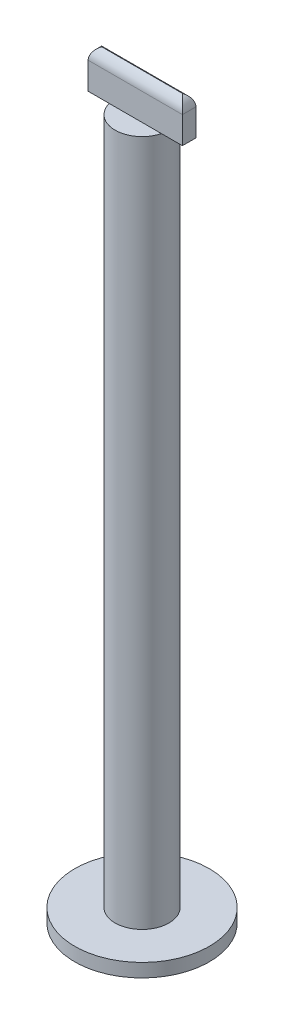
ISO-10303-21;
HEADER;
FILE_DESCRIPTION(('STEP AP214'),'2;1');
FILE_NAME('part.step','',(''),(''),'','','');
FILE_SCHEMA(('AUTOMOTIVE_DESIGN { 1 0 10303 214 1 1 1 1 }'));
ENDSEC;
DATA;
#1=APPLICATION_CONTEXT('core data for automotive mechanical design processes');
#2=APPLICATION_PROTOCOL_DEFINITION('international standard','automotive_design',2000,#1);
#3=PRODUCT_CONTEXT('',#1,'mechanical');
#4=PRODUCT('Part','Part','',(#3));
#5=PRODUCT_RELATED_PRODUCT_CATEGORY('part','',(#4));
#6=PRODUCT_DEFINITION_FORMATION('','',#4);
#7=PRODUCT_DEFINITION_CONTEXT('part definition',#1,'design');
#8=PRODUCT_DEFINITION('design','',#6,#7);
#9=PRODUCT_DEFINITION_SHAPE('','',#8);
#10=(LENGTH_UNIT() NAMED_UNIT(*) SI_UNIT(.MILLI.,.METRE.));
#11=(NAMED_UNIT(*) PLANE_ANGLE_UNIT() SI_UNIT($,.RADIAN.));
#12=(NAMED_UNIT(*) SI_UNIT($,.STERADIAN.) SOLID_ANGLE_UNIT());
#13=UNCERTAINTY_MEASURE_WITH_UNIT(LENGTH_MEASURE(1.E-05),#10,'distance_accuracy_value','');
#14=(GEOMETRIC_REPRESENTATION_CONTEXT(3) GLOBAL_UNCERTAINTY_ASSIGNED_CONTEXT((#13)) GLOBAL_UNIT_ASSIGNED_CONTEXT((#10,
#11,#12)) REPRESENTATION_CONTEXT('',''));
#15=CARTESIAN_POINT('',(0.,0.,0.));
#16=DIRECTION('',(0.,0.,1.));
#17=DIRECTION('',(1.,0.,0.));
#18=AXIS2_PLACEMENT_3D('',#15,#16,#17);
#19=CARTESIAN_POINT('',(2.5,54.,0.));
#20=DIRECTION('',(0.,0.,-1.));
#21=DIRECTION('',(-1.,0.,0.));
#22=AXIS2_PLACEMENT_3D('',#19,#20,#21);
#23=CYLINDRICAL_SURFACE('',#22,1.);
#24=CARTESIAN_POINT('',(2.5,54.,0.5));
#25=DIRECTION('',(-0.707106781186547,0.,-0.707106781186547));
#26=DIRECTION('',(0.707106781186547,0.,-0.707106781186547));
#27=AXIS2_PLACEMENT_3D('',#24,#25,#26);
#28=ELLIPSE('',#27,1.41421356237309,1.);
#29=CARTESIAN_POINT('',(3.5,54.,-0.5));
#30=VERTEX_POINT('',#29);
#31=CARTESIAN_POINT('',(3.,54.8660254037844,0.));
#32=VERTEX_POINT('',#31);
#33=EDGE_CURVE('E127',#30,#32,#28,.F.);
#34=ORIENTED_EDGE('',*,*,#33,.T.);
#35=CARTESIAN_POINT('',(2.5,54.,-0.5));
#36=DIRECTION('',(0.707106781186547,0.,-0.707106781186547));
#37=DIRECTION('',(-0.707106781186547,0.,-0.707106781186547));
#38=AXIS2_PLACEMENT_3D('',#35,#36,#37);
#39=ELLIPSE('',#38,1.41421356237309,1.);
#40=CARTESIAN_POINT('',(3.5,54.,0.5));
#41=VERTEX_POINT('',#40);
#42=EDGE_CURVE('E159',#41,#32,#39,.F.);
#43=ORIENTED_EDGE('',*,*,#42,.F.);
#44=DIRECTION('',(0.,0.,-1.));
#45=VECTOR('',#44,1.);
#46=CARTESIAN_POINT('',(3.5,54.,0.5));
#47=LINE('',#46,#45);
#48=EDGE_CURVE('E47',#30,#41,#47,.F.);
#49=ORIENTED_EDGE('',*,*,#48,.F.);
#50=EDGE_LOOP('',(#34,#43,#49));
#51=FACE_BOUND('',#50,.T.);
#52=ADVANCED_FACE('F39',(#51),#23,.T.);
#53=CARTESIAN_POINT('',(0.,54.,0.5));
#54=DIRECTION('',(-1.,0.,0.));
#55=DIRECTION('',(0.,0.,1.));
#56=AXIS2_PLACEMENT_3D('',#53,#54,#55);
#57=CYLINDRICAL_SURFACE('',#56,1.);
#58=DIRECTION('',(-1.,0.,0.));
#59=VECTOR('',#58,1.);
#60=CARTESIAN_POINT('',(0.,54.8660254037844,0.));
#61=LINE('',#60,#59);
#62=CARTESIAN_POINT('',(-3.,54.8660254037844,0.));
#63=VERTEX_POINT('',#62);
#64=EDGE_CURVE('E11',#32,#63,#61,.T.);
#65=ORIENTED_EDGE('',*,*,#64,.F.);
#66=ORIENTED_EDGE('',*,*,#33,.F.);
#67=DIRECTION('',(-1.,0.,0.));
#68=VECTOR('',#67,1.);
#69=CARTESIAN_POINT('',(-3.5,54.,-0.5));
#70=LINE('',#69,#68);
#71=CARTESIAN_POINT('',(-3.5,54.,-0.5));
#72=VERTEX_POINT('',#71);
#73=EDGE_CURVE('E101',#72,#30,#70,.F.);
#74=ORIENTED_EDGE('',*,*,#73,.F.);
#75=CARTESIAN_POINT('',(-2.5,54.,0.5));
#76=DIRECTION('',(-0.707106781186547,0.,0.707106781186547));
#77=DIRECTION('',(-0.707106781186547,0.,-0.707106781186547));
#78=AXIS2_PLACEMENT_3D('',#75,#76,#77);
#79=ELLIPSE('',#78,1.41421356237309,1.);
#80=EDGE_CURVE('E124',#63,#72,#79,.T.);
#81=ORIENTED_EDGE('',*,*,#80,.F.);
#82=EDGE_LOOP('',(#65,#66,#74,#81));
#83=FACE_BOUND('',#82,.T.);
#84=ADVANCED_FACE('F41',(#83),#57,.T.);
#85=CARTESIAN_POINT('',(-2.5,54.,0.));
#86=DIRECTION('',(0.,0.,1.));
#87=DIRECTION('',(1.,0.,0.));
#88=AXIS2_PLACEMENT_3D('',#85,#86,#87);
#89=CYLINDRICAL_SURFACE('',#88,1.);
#90=CARTESIAN_POINT('',(-2.5,54.,-0.5));
#91=DIRECTION('',(0.707106781186547,0.,0.707106781186547));
#92=DIRECTION('',(-0.707106781186547,0.,0.707106781186547));
#93=AXIS2_PLACEMENT_3D('',#90,#91,#92);
#94=ELLIPSE('',#93,1.41421356237309,1.);
#95=CARTESIAN_POINT('',(-3.5,54.,0.5));
#96=VERTEX_POINT('',#95);
#97=EDGE_CURVE('E161',#63,#96,#94,.T.);
#98=ORIENTED_EDGE('',*,*,#97,.F.);
#99=ORIENTED_EDGE('',*,*,#80,.T.);
#100=DIRECTION('',(0.,0.,1.));
#101=VECTOR('',#100,1.);
#102=CARTESIAN_POINT('',(-3.5,54.,0.5));
#103=LINE('',#102,#101);
#104=EDGE_CURVE('E154',#96,#72,#103,.F.);
#105=ORIENTED_EDGE('',*,*,#104,.F.);
#106=EDGE_LOOP('',(#98,#99,#105));
#107=FACE_BOUND('',#106,.T.);
#108=ADVANCED_FACE('F169',(#107),#89,.T.);
#109=CARTESIAN_POINT('',(0.,54.,-0.5));
#110=DIRECTION('',(1.,0.,0.));
#111=DIRECTION('',(0.,0.,-1.));
#112=AXIS2_PLACEMENT_3D('',#109,#110,#111);
#113=CYLINDRICAL_SURFACE('',#112,1.);
#114=ORIENTED_EDGE('',*,*,#42,.T.);
#115=ORIENTED_EDGE('',*,*,#64,.T.);
#116=ORIENTED_EDGE('',*,*,#97,.T.);
#117=DIRECTION('',(1.,0.,0.));
#118=VECTOR('',#117,1.);
#119=CARTESIAN_POINT('',(-3.5,54.,0.5));
#120=LINE('',#119,#118);
#121=EDGE_CURVE('E151',#41,#96,#120,.F.);
#122=ORIENTED_EDGE('',*,*,#121,.F.);
#123=EDGE_LOOP('',(#114,#115,#116,#122));
#124=FACE_BOUND('',#123,.T.);
#125=ADVANCED_FACE('F171',(#124),#113,.T.);
#126=CARTESIAN_POINT('',(0.,52.,0.));
#127=DIRECTION('',(0.,1.,0.));
#128=DIRECTION('',(0.,0.,1.));
#129=AXIS2_PLACEMENT_3D('',#126,#127,#128);
#130=PLANE('',#129);
#131=DIRECTION('',(1.,0.,0.));
#132=VECTOR('',#131,1.);
#133=CARTESIAN_POINT('',(-3.5,52.,0.5));
#134=LINE('',#133,#132);
#135=CARTESIAN_POINT('',(-1.93649167310371,52.,0.5));
#136=VERTEX_POINT('',#135);
#137=CARTESIAN_POINT('',(1.93649167310371,52.,0.5));
#138=VERTEX_POINT('',#137);
#139=EDGE_CURVE('E135',#136,#138,#134,.T.);
#140=ORIENTED_EDGE('',*,*,#139,.F.);
#141=CARTESIAN_POINT('',(0.,52.,0.));
#142=DIRECTION('',(0.,1.,0.));
#143=DIRECTION('',(0.,0.,1.));
#144=AXIS2_PLACEMENT_3D('',#141,#142,#143);
#145=CIRCLE('',#144,2.);
#146=EDGE_CURVE('E143',#136,#138,#145,.T.);
#147=ORIENTED_EDGE('',*,*,#146,.T.);
#148=EDGE_LOOP('',(#140,#147));
#149=FACE_BOUND('',#148,.T.);
#150=ADVANCED_FACE('F194',(#149),#130,.T.);
#151=CARTESIAN_POINT('',(0.,52.,0.));
#152=DIRECTION('',(0.,-1.,0.));
#153=DIRECTION('',(0.,0.,-1.));
#154=AXIS2_PLACEMENT_3D('',#151,#152,#153);
#155=CYLINDRICAL_SURFACE('',#154,2.);
#156=CARTESIAN_POINT('',(1.93649167310371,52.,-0.5));
#157=VERTEX_POINT('',#156);
#158=EDGE_CURVE('E115',#138,#157,#145,.T.);
#159=ORIENTED_EDGE('',*,*,#158,.F.);
#160=ORIENTED_EDGE('',*,*,#146,.F.);
#161=CARTESIAN_POINT('',(-1.93649167310371,52.,-0.5));
#162=VERTEX_POINT('',#161);
#163=EDGE_CURVE('E184',#162,#136,#145,.T.);
#164=ORIENTED_EDGE('',*,*,#163,.F.);
#165=EDGE_CURVE('E148',#157,#162,#145,.T.);
#166=ORIENTED_EDGE('',*,*,#165,.F.);
#167=EDGE_LOOP('',(#159,#160,#164,#166));
#168=FACE_BOUND('',#167,.T.);
#169=CARTESIAN_POINT('',(0.,1.,0.));
#170=DIRECTION('',(0.,-1.,0.));
#171=DIRECTION('',(0.,0.,-1.));
#172=AXIS2_PLACEMENT_3D('',#169,#170,#171);
#173=CIRCLE('',#172,2.);
#174=CARTESIAN_POINT('',(0.,1.,-2.));
#175=VERTEX_POINT('',#174);
#176=EDGE_CURVE('E147',#175,#175,#173,.T.);
#177=ORIENTED_EDGE('',*,*,#176,.F.);
#178=EDGE_LOOP('',(#177));
#179=FACE_BOUND('',#178,.T.);
#180=ADVANCED_FACE('F192',(#168,#179),#155,.T.);
#181=DIRECTION('',(-1.,0.,0.));
#182=VECTOR('',#181,1.);
#183=CARTESIAN_POINT('',(-3.5,52.,-0.5));
#184=LINE('',#183,#182);
#185=EDGE_CURVE('E119',#157,#162,#184,.T.);
#186=ORIENTED_EDGE('',*,*,#185,.F.);
#187=ORIENTED_EDGE('',*,*,#165,.T.);
#188=EDGE_LOOP('',(#186,#187));
#189=FACE_BOUND('',#188,.T.);
#190=ADVANCED_FACE('F190',(#189),#130,.T.);
#191=CARTESIAN_POINT('',(0.,1.,0.));
#192=DIRECTION('',(0.,-1.,0.));
#193=DIRECTION('',(0.,0.,-1.));
#194=AXIS2_PLACEMENT_3D('',#191,#192,#193);
#195=CYLINDRICAL_SURFACE('',#194,5.);
#196=CARTESIAN_POINT('',(0.,1.,0.));
#197=DIRECTION('',(0.,-1.,0.));
#198=DIRECTION('',(0.,0.,-1.));
#199=AXIS2_PLACEMENT_3D('',#196,#197,#198);
#200=CIRCLE('',#199,5.);
#201=CARTESIAN_POINT('',(0.,1.,-5.));
#202=VERTEX_POINT('',#201);
#203=EDGE_CURVE('E140',#202,#202,#200,.T.);
#204=ORIENTED_EDGE('',*,*,#203,.T.);
#205=EDGE_LOOP('',(#204));
#206=FACE_BOUND('',#205,.T.);
#207=CARTESIAN_POINT('',(0.,0.,0.));
#208=DIRECTION('',(0.,-1.,0.));
#209=DIRECTION('',(0.,0.,-1.));
#210=AXIS2_PLACEMENT_3D('',#207,#208,#209);
#211=CIRCLE('',#210,5.);
#212=CARTESIAN_POINT('',(0.,0.,-5.));
#213=VERTEX_POINT('',#212);
#214=EDGE_CURVE('E105',#213,#213,#211,.T.);
#215=ORIENTED_EDGE('',*,*,#214,.F.);
#216=EDGE_LOOP('',(#215));
#217=FACE_BOUND('',#216,.T.);
#218=ADVANCED_FACE('F207',(#206,#217),#195,.T.);
#219=CARTESIAN_POINT('',(0.,1.,0.));
#220=DIRECTION('',(0.,-1.,0.));
#221=DIRECTION('',(0.,0.,-1.));
#222=AXIS2_PLACEMENT_3D('',#219,#220,#221);
#223=PLANE('',#222);
#224=ORIENTED_EDGE('',*,*,#176,.T.);
#225=EDGE_LOOP('',(#224));
#226=FACE_BOUND('',#225,.T.);
#227=ORIENTED_EDGE('',*,*,#203,.F.);
#228=EDGE_LOOP('',(#227));
#229=FACE_BOUND('',#228,.T.);
#230=ADVANCED_FACE('F281',(#226,#229),#223,.F.);
#231=CARTESIAN_POINT('',(0.,0.,0.));
#232=DIRECTION('',(0.,1.,0.));
#233=DIRECTION('',(0.,0.,1.));
#234=AXIS2_PLACEMENT_3D('',#231,#232,#233);
#235=PLANE('',#234);
#236=ORIENTED_EDGE('',*,*,#214,.T.);
#237=EDGE_LOOP('',(#236));
#238=FACE_BOUND('',#237,.T.);
#239=ADVANCED_FACE('F261',(#238),#235,.F.);
#240=CARTESIAN_POINT('',(0.,52.,0.));
#241=DIRECTION('',(0.,-1.,0.));
#242=DIRECTION('',(0.,0.,-1.));
#243=AXIS2_PLACEMENT_3D('',#240,#241,#242);
#244=PLANE('',#243);
#245=CARTESIAN_POINT('',(3.5,52.,0.5));
#246=VERTEX_POINT('',#245);
#247=EDGE_CURVE('E131',#138,#246,#134,.T.);
#248=ORIENTED_EDGE('',*,*,#247,.F.);
#249=ORIENTED_EDGE('',*,*,#158,.T.);
#250=CARTESIAN_POINT('',(3.5,52.,-0.5));
#251=VERTEX_POINT('',#250);
#252=EDGE_CURVE('E99',#251,#157,#184,.T.);
#253=ORIENTED_EDGE('',*,*,#252,.F.);
#254=DIRECTION('',(0.,0.,-1.));
#255=VECTOR('',#254,1.);
#256=CARTESIAN_POINT('',(3.5,52.,0.5));
#257=LINE('',#256,#255);
#258=EDGE_CURVE('E113',#246,#251,#257,.T.);
#259=ORIENTED_EDGE('',*,*,#258,.F.);
#260=EDGE_LOOP('',(#248,#249,#253,#259));
#261=FACE_BOUND('',#260,.T.);
#262=ADVANCED_FACE('F112',(#261),#244,.T.);
#263=CARTESIAN_POINT('',(3.5,55.,0.5));
#264=DIRECTION('',(-1.,0.,0.));
#265=DIRECTION('',(0.,0.,1.));
#266=AXIS2_PLACEMENT_3D('',#263,#264,#265);
#267=PLANE('',#266);
#268=DIRECTION('',(0.,-1.,0.));
#269=VECTOR('',#268,1.);
#270=CARTESIAN_POINT('',(3.5,55.,-0.5));
#271=LINE('',#270,#269);
#272=EDGE_CURVE('E94',#30,#251,#271,.T.);
#273=ORIENTED_EDGE('',*,*,#272,.F.);
#274=ORIENTED_EDGE('',*,*,#48,.T.);
#275=DIRECTION('',(0.,-1.,0.));
#276=VECTOR('',#275,1.);
#277=CARTESIAN_POINT('',(3.5,55.,0.5));
#278=LINE('',#277,#276);
#279=EDGE_CURVE('E122',#41,#246,#278,.T.);
#280=ORIENTED_EDGE('',*,*,#279,.T.);
#281=ORIENTED_EDGE('',*,*,#258,.T.);
#282=EDGE_LOOP('',(#273,#274,#280,#281));
#283=FACE_BOUND('',#282,.T.);
#284=ADVANCED_FACE('F120',(#283),#267,.F.);
#285=CARTESIAN_POINT('',(-3.5,55.,-0.5));
#286=DIRECTION('',(0.,0.,1.));
#287=DIRECTION('',(1.,0.,0.));
#288=AXIS2_PLACEMENT_3D('',#285,#286,#287);
#289=PLANE('',#288);
#290=DIRECTION('',(0.,-1.,0.));
#291=VECTOR('',#290,1.);
#292=CARTESIAN_POINT('',(-3.5,55.,-0.5));
#293=LINE('',#292,#291);
#294=CARTESIAN_POINT('',(-3.5,52.,-0.5));
#295=VERTEX_POINT('',#294);
#296=EDGE_CURVE('E106',#72,#295,#293,.T.);
#297=ORIENTED_EDGE('',*,*,#296,.F.);
#298=ORIENTED_EDGE('',*,*,#73,.T.);
#299=ORIENTED_EDGE('',*,*,#272,.T.);
#300=ORIENTED_EDGE('',*,*,#252,.T.);
#301=ORIENTED_EDGE('',*,*,#185,.T.);
#302=EDGE_CURVE('E117',#162,#295,#184,.T.);
#303=ORIENTED_EDGE('',*,*,#302,.T.);
#304=EDGE_LOOP('',(#297,#298,#299,#300,#301,#303));
#305=FACE_BOUND('',#304,.T.);
#306=ADVANCED_FACE('F97',(#305),#289,.F.);
#307=CARTESIAN_POINT('',(-3.5,55.,0.5));
#308=DIRECTION('',(1.,0.,0.));
#309=DIRECTION('',(0.,0.,-1.));
#310=AXIS2_PLACEMENT_3D('',#307,#308,#309);
#311=PLANE('',#310);
#312=DIRECTION('',(0.,-1.,0.));
#313=VECTOR('',#312,1.);
#314=CARTESIAN_POINT('',(-3.5,55.,0.5));
#315=LINE('',#314,#313);
#316=CARTESIAN_POINT('',(-3.5,52.,0.5));
#317=VERTEX_POINT('',#316);
#318=EDGE_CURVE('E137',#96,#317,#315,.T.);
#319=ORIENTED_EDGE('',*,*,#318,.F.);
#320=ORIENTED_EDGE('',*,*,#104,.T.);
#321=ORIENTED_EDGE('',*,*,#296,.T.);
#322=DIRECTION('',(0.,0.,1.));
#323=VECTOR('',#322,1.);
#324=CARTESIAN_POINT('',(-3.5,52.,0.5));
#325=LINE('',#324,#323);
#326=EDGE_CURVE('E116',#295,#317,#325,.T.);
#327=ORIENTED_EDGE('',*,*,#326,.T.);
#328=EDGE_LOOP('',(#319,#320,#321,#327));
#329=FACE_BOUND('',#328,.T.);
#330=ADVANCED_FACE('F176',(#329),#311,.F.);
#331=CARTESIAN_POINT('',(-3.5,55.,0.5));
#332=DIRECTION('',(0.,0.,-1.));
#333=DIRECTION('',(-1.,0.,0.));
#334=AXIS2_PLACEMENT_3D('',#331,#332,#333);
#335=PLANE('',#334);
#336=ORIENTED_EDGE('',*,*,#279,.F.);
#337=ORIENTED_EDGE('',*,*,#121,.T.);
#338=ORIENTED_EDGE('',*,*,#318,.T.);
#339=EDGE_CURVE('E132',#317,#136,#134,.T.);
#340=ORIENTED_EDGE('',*,*,#339,.T.);
#341=ORIENTED_EDGE('',*,*,#139,.T.);
#342=ORIENTED_EDGE('',*,*,#247,.T.);
#343=EDGE_LOOP('',(#336,#337,#338,#340,#341,#342));
#344=FACE_BOUND('',#343,.T.);
#345=ADVANCED_FACE('F174',(#344),#335,.F.);
#346=ORIENTED_EDGE('',*,*,#302,.F.);
#347=ORIENTED_EDGE('',*,*,#163,.T.);
#348=ORIENTED_EDGE('',*,*,#339,.F.);
#349=ORIENTED_EDGE('',*,*,#326,.F.);
#350=EDGE_LOOP('',(#346,#347,#348,#349));
#351=FACE_BOUND('',#350,.T.);
#352=ADVANCED_FACE('F182',(#351),#244,.T.);
#353=CLOSED_SHELL('',(#52,#84,#108,#125,#150,#180,#190,#218,#230,#239,#262,#284,#306,#330,#345,#352));
#354=MANIFOLD_SOLID_BREP('B2',#353);
#355=ADVANCED_BREP_SHAPE_REPRESENTATION('',(#18,#354),#14);
#356=SHAPE_DEFINITION_REPRESENTATION(#9,#355);
ENDSEC;
END-ISO-10303-21;
